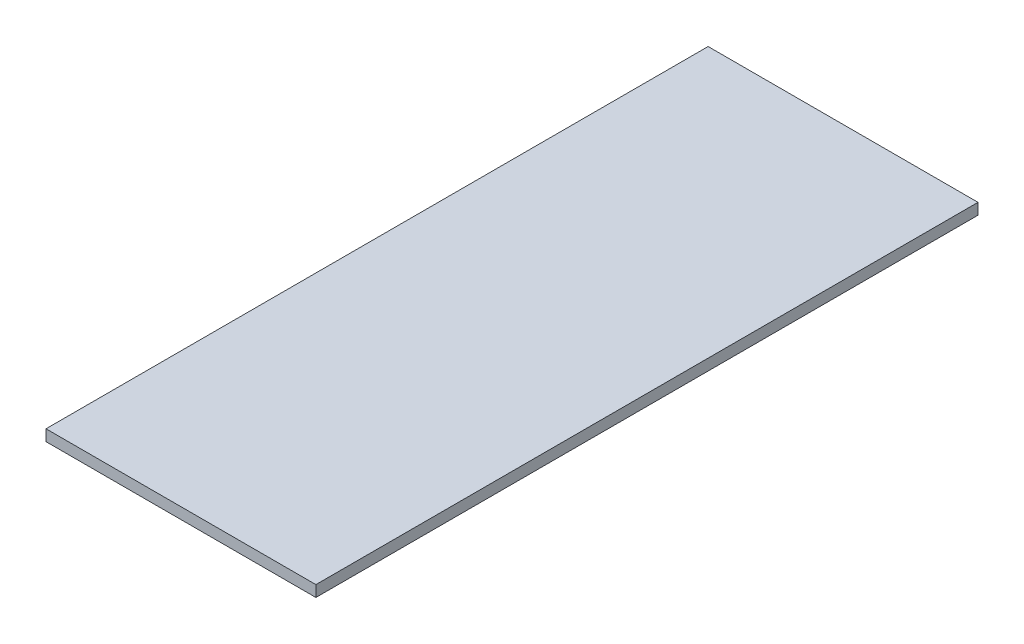
ISO-10303-21;
HEADER;
FILE_DESCRIPTION(('STEP AP214'),'2;1');
FILE_NAME('part.step','',(''),(''),'','','');
FILE_SCHEMA(('AUTOMOTIVE_DESIGN { 1 0 10303 214 1 1 1 1 }'));
ENDSEC;
DATA;
#1=APPLICATION_CONTEXT('core data for automotive mechanical design processes');
#2=APPLICATION_PROTOCOL_DEFINITION('international standard','automotive_design',2000,#1);
#3=PRODUCT_CONTEXT('',#1,'mechanical');
#4=PRODUCT('Part','Part','',(#3));
#5=PRODUCT_RELATED_PRODUCT_CATEGORY('part','',(#4));
#6=PRODUCT_DEFINITION_FORMATION('','',#4);
#7=PRODUCT_DEFINITION_CONTEXT('part definition',#1,'design');
#8=PRODUCT_DEFINITION('design','',#6,#7);
#9=PRODUCT_DEFINITION_SHAPE('','',#8);
#10=(LENGTH_UNIT() NAMED_UNIT(*) SI_UNIT(.MILLI.,.METRE.));
#11=(NAMED_UNIT(*) PLANE_ANGLE_UNIT() SI_UNIT($,.RADIAN.));
#12=(NAMED_UNIT(*) SI_UNIT($,.STERADIAN.) SOLID_ANGLE_UNIT());
#13=UNCERTAINTY_MEASURE_WITH_UNIT(LENGTH_MEASURE(1.E-05),#10,'distance_accuracy_value','');
#14=(GEOMETRIC_REPRESENTATION_CONTEXT(3) GLOBAL_UNCERTAINTY_ASSIGNED_CONTEXT((#13)) GLOBAL_UNIT_ASSIGNED_CONTEXT((#10,
#11,#12)) REPRESENTATION_CONTEXT('',''));
#15=CARTESIAN_POINT('',(0.,0.,0.));
#16=DIRECTION('',(0.,0.,1.));
#17=DIRECTION('',(1.,0.,0.));
#18=AXIS2_PLACEMENT_3D('',#15,#16,#17);
#19=CARTESIAN_POINT('',(-30.6734430186792,2.54,75.251056636485));
#20=DIRECTION('',(-1.,0.,0.));
#21=DIRECTION('',(0.,0.,1.));
#22=AXIS2_PLACEMENT_3D('',#19,#20,#21);
#23=PLANE('',#22);
#24=DIRECTION('',(0.,0.,-1.));
#25=VECTOR('',#24,1.);
#26=CARTESIAN_POINT('',(-30.6734430186792,0.,75.251056636485));
#27=LINE('',#26,#25);
#28=CARTESIAN_POINT('',(-30.6734430186792,0.,75.251056636485));
#29=VERTEX_POINT('',#28);
#30=CARTESIAN_POINT('',(-30.6734430186792,0.,-75.251056636485));
#31=VERTEX_POINT('',#30);
#32=EDGE_CURVE('E116',#29,#31,#27,.T.);
#33=ORIENTED_EDGE('',*,*,#32,.F.);
#34=DIRECTION('',(0.,-1.,0.));
#35=VECTOR('',#34,1.);
#36=CARTESIAN_POINT('',(-30.6734430186792,2.54,75.251056636485));
#37=LINE('',#36,#35);
#38=CARTESIAN_POINT('',(-30.6734430186792,2.54,75.251056636485));
#39=VERTEX_POINT('',#38);
#40=EDGE_CURVE('E11',#39,#29,#37,.T.);
#41=ORIENTED_EDGE('',*,*,#40,.F.);
#42=DIRECTION('',(0.,0.,-1.));
#43=VECTOR('',#42,1.);
#44=CARTESIAN_POINT('',(-30.6734430186792,2.54,75.251056636485));
#45=LINE('',#44,#43);
#46=CARTESIAN_POINT('',(-30.6734430186792,2.54,-75.251056636485));
#47=VERTEX_POINT('',#46);
#48=EDGE_CURVE('E109',#39,#47,#45,.T.);
#49=ORIENTED_EDGE('',*,*,#48,.T.);
#50=DIRECTION('',(0.,-1.,0.));
#51=VECTOR('',#50,1.);
#52=CARTESIAN_POINT('',(-30.6734430186792,2.54,-75.251056636485));
#53=LINE('',#52,#51);
#54=EDGE_CURVE('E48',#47,#31,#53,.T.);
#55=ORIENTED_EDGE('',*,*,#54,.T.);
#56=EDGE_LOOP('',(#33,#41,#49,#55));
#57=FACE_BOUND('',#56,.T.);
#58=ADVANCED_FACE('F45',(#57),#23,.T.);
#59=CARTESIAN_POINT('',(-30.6734430186792,2.54,75.251056636485));
#60=DIRECTION('',(0.,0.,-1.));
#61=DIRECTION('',(-1.,0.,0.));
#62=AXIS2_PLACEMENT_3D('',#59,#60,#61);
#63=PLANE('',#62);
#64=DIRECTION('',(1.,0.,0.));
#65=VECTOR('',#64,1.);
#66=CARTESIAN_POINT('',(-30.6734430186792,0.,75.251056636485));
#67=LINE('',#66,#65);
#68=CARTESIAN_POINT('',(30.6734430186792,0.,75.251056636485));
#69=VERTEX_POINT('',#68);
#70=EDGE_CURVE('E79',#29,#69,#67,.T.);
#71=ORIENTED_EDGE('',*,*,#70,.T.);
#72=DIRECTION('',(0.,-1.,0.));
#73=VECTOR('',#72,1.);
#74=CARTESIAN_POINT('',(30.6734430186792,2.54,75.251056636485));
#75=LINE('',#74,#73);
#76=CARTESIAN_POINT('',(30.6734430186792,2.54,75.251056636485));
#77=VERTEX_POINT('',#76);
#78=EDGE_CURVE('E55',#77,#69,#75,.T.);
#79=ORIENTED_EDGE('',*,*,#78,.F.);
#80=DIRECTION('',(1.,0.,0.));
#81=VECTOR('',#80,1.);
#82=CARTESIAN_POINT('',(-30.6734430186792,2.54,75.251056636485));
#83=LINE('',#82,#81);
#84=EDGE_CURVE('E96',#39,#77,#83,.T.);
#85=ORIENTED_EDGE('',*,*,#84,.F.);
#86=ORIENTED_EDGE('',*,*,#40,.T.);
#87=EDGE_LOOP('',(#71,#79,#85,#86));
#88=FACE_BOUND('',#87,.T.);
#89=ADVANCED_FACE('F132',(#88),#63,.F.);
#90=CARTESIAN_POINT('',(30.6734430186792,2.54,75.251056636485));
#91=DIRECTION('',(-1.,0.,0.));
#92=DIRECTION('',(0.,0.,1.));
#93=AXIS2_PLACEMENT_3D('',#90,#91,#92);
#94=PLANE('',#93);
#95=DIRECTION('',(0.,0.,-1.));
#96=VECTOR('',#95,1.);
#97=CARTESIAN_POINT('',(30.6734430186792,0.,75.251056636485));
#98=LINE('',#97,#96);
#99=CARTESIAN_POINT('',(30.6734430186792,0.,-75.251056636485));
#100=VERTEX_POINT('',#99);
#101=EDGE_CURVE('E104',#69,#100,#98,.T.);
#102=ORIENTED_EDGE('',*,*,#101,.T.);
#103=DIRECTION('',(0.,-1.,0.));
#104=VECTOR('',#103,1.);
#105=CARTESIAN_POINT('',(30.6734430186792,2.54,-75.251056636485));
#106=LINE('',#105,#104);
#107=CARTESIAN_POINT('',(30.6734430186792,2.54,-75.251056636485));
#108=VERTEX_POINT('',#107);
#109=EDGE_CURVE('E101',#108,#100,#106,.T.);
#110=ORIENTED_EDGE('',*,*,#109,.F.);
#111=DIRECTION('',(0.,0.,-1.));
#112=VECTOR('',#111,1.);
#113=CARTESIAN_POINT('',(30.6734430186792,2.54,75.251056636485));
#114=LINE('',#113,#112);
#115=EDGE_CURVE('E91',#77,#108,#114,.T.);
#116=ORIENTED_EDGE('',*,*,#115,.F.);
#117=ORIENTED_EDGE('',*,*,#78,.T.);
#118=EDGE_LOOP('',(#102,#110,#116,#117));
#119=FACE_BOUND('',#118,.T.);
#120=ADVANCED_FACE('F102',(#119),#94,.F.);
#121=CARTESIAN_POINT('',(-30.6734430186792,2.54,-75.251056636485));
#122=DIRECTION('',(0.,0.,-1.));
#123=DIRECTION('',(-1.,0.,0.));
#124=AXIS2_PLACEMENT_3D('',#121,#122,#123);
#125=PLANE('',#124);
#126=DIRECTION('',(1.,0.,0.));
#127=VECTOR('',#126,1.);
#128=CARTESIAN_POINT('',(-30.6734430186792,0.,-75.251056636485));
#129=LINE('',#128,#127);
#130=EDGE_CURVE('E120',#31,#100,#129,.T.);
#131=ORIENTED_EDGE('',*,*,#130,.F.);
#132=ORIENTED_EDGE('',*,*,#54,.F.);
#133=DIRECTION('',(1.,0.,0.));
#134=VECTOR('',#133,1.);
#135=CARTESIAN_POINT('',(-30.6734430186792,2.54,-75.251056636485));
#136=LINE('',#135,#134);
#137=EDGE_CURVE('E95',#47,#108,#136,.T.);
#138=ORIENTED_EDGE('',*,*,#137,.T.);
#139=ORIENTED_EDGE('',*,*,#109,.T.);
#140=EDGE_LOOP('',(#131,#132,#138,#139));
#141=FACE_BOUND('',#140,.T.);
#142=ADVANCED_FACE('F107',(#141),#125,.T.);
#143=CARTESIAN_POINT('',(0.,2.54,0.));
#144=DIRECTION('',(0.,-1.,0.));
#145=DIRECTION('',(0.,0.,-1.));
#146=AXIS2_PLACEMENT_3D('',#143,#144,#145);
#147=PLANE('',#146);
#148=ORIENTED_EDGE('',*,*,#48,.F.);
#149=ORIENTED_EDGE('',*,*,#84,.T.);
#150=ORIENTED_EDGE('',*,*,#115,.T.);
#151=ORIENTED_EDGE('',*,*,#137,.F.);
#152=EDGE_LOOP('',(#148,#149,#150,#151));
#153=FACE_BOUND('',#152,.T.);
#154=ADVANCED_FACE('F94',(#153),#147,.F.);
#155=CARTESIAN_POINT('',(0.,0.,0.));
#156=DIRECTION('',(0.,-1.,0.));
#157=DIRECTION('',(0.,0.,-1.));
#158=AXIS2_PLACEMENT_3D('',#155,#156,#157);
#159=PLANE('',#158);
#160=ORIENTED_EDGE('',*,*,#32,.T.);
#161=ORIENTED_EDGE('',*,*,#130,.T.);
#162=ORIENTED_EDGE('',*,*,#101,.F.);
#163=ORIENTED_EDGE('',*,*,#70,.F.);
#164=EDGE_LOOP('',(#160,#161,#162,#163));
#165=FACE_BOUND('',#164,.T.);
#166=ADVANCED_FACE('F129',(#165),#159,.T.);
#167=CLOSED_SHELL('',(#58,#89,#120,#142,#154,#166));
#168=MANIFOLD_SOLID_BREP('B2',#167);
#169=ADVANCED_BREP_SHAPE_REPRESENTATION('',(#18,#168),#14);
#170=SHAPE_DEFINITION_REPRESENTATION(#9,#169);
ENDSEC;
END-ISO-10303-21;
